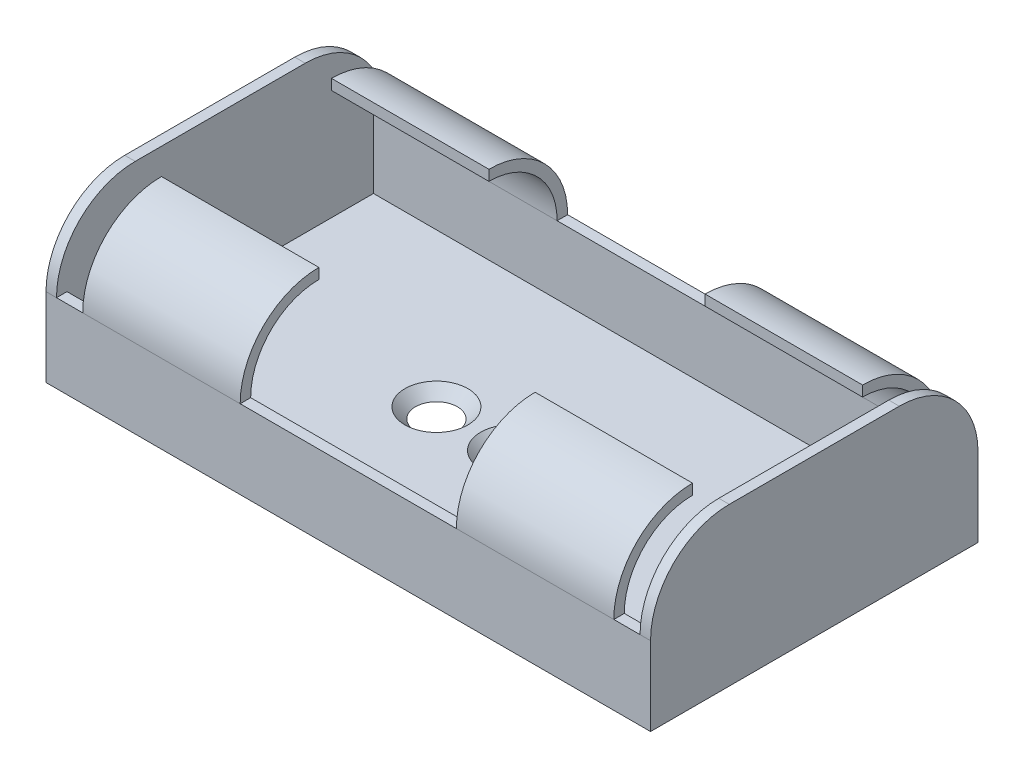
ISO-10303-21;
HEADER;
FILE_DESCRIPTION(('STEP AP214'),'2;1');
FILE_NAME('part.step','',(''),(''),'','','');
FILE_SCHEMA(('AUTOMOTIVE_DESIGN { 1 0 10303 214 1 1 1 1 }'));
ENDSEC;
DATA;
#1=APPLICATION_CONTEXT('core data for automotive mechanical design processes');
#2=APPLICATION_PROTOCOL_DEFINITION('international standard','automotive_design',2000,#1);
#3=PRODUCT_CONTEXT('',#1,'mechanical');
#4=PRODUCT('Part','Part','',(#3));
#5=PRODUCT_RELATED_PRODUCT_CATEGORY('part','',(#4));
#6=PRODUCT_DEFINITION_FORMATION('','',#4);
#7=PRODUCT_DEFINITION_CONTEXT('part definition',#1,'design');
#8=PRODUCT_DEFINITION('design','',#6,#7);
#9=PRODUCT_DEFINITION_SHAPE('','',#8);
#10=(LENGTH_UNIT() NAMED_UNIT(*) SI_UNIT(.MILLI.,.METRE.));
#11=(NAMED_UNIT(*) PLANE_ANGLE_UNIT() SI_UNIT($,.RADIAN.));
#12=(NAMED_UNIT(*) SI_UNIT($,.STERADIAN.) SOLID_ANGLE_UNIT());
#13=UNCERTAINTY_MEASURE_WITH_UNIT(LENGTH_MEASURE(1.E-05),#10,'distance_accuracy_value','');
#14=(GEOMETRIC_REPRESENTATION_CONTEXT(3) GLOBAL_UNCERTAINTY_ASSIGNED_CONTEXT((#13)) GLOBAL_UNIT_ASSIGNED_CONTEXT((#10,
#11,#12)) REPRESENTATION_CONTEXT('',''));
#15=CARTESIAN_POINT('',(0.,0.,0.));
#16=DIRECTION('',(0.,0.,1.));
#17=DIRECTION('',(1.,0.,0.));
#18=AXIS2_PLACEMENT_3D('',#15,#16,#17);
#19=CARTESIAN_POINT('',(0.,7.5,-8.1));
#20=DIRECTION('',(1.,0.,0.));
#21=DIRECTION('',(0.,0.,-1.));
#22=AXIS2_PLACEMENT_3D('',#19,#20,#21);
#23=CYLINDRICAL_SURFACE('',#22,7.5);
#24=CARTESIAN_POINT('',(-27.8,7.5,-8.1));
#25=DIRECTION('',(-1.,0.,0.));
#26=DIRECTION('',(0.,0.,1.));
#27=AXIS2_PLACEMENT_3D('',#24,#25,#26);
#28=CIRCLE('',#27,7.5);
#29=CARTESIAN_POINT('',(-27.8,7.5,-15.6));
#30=VERTEX_POINT('',#29);
#31=CARTESIAN_POINT('',(-27.8,15.,-8.1));
#32=VERTEX_POINT('',#31);
#33=EDGE_CURVE('E233',#30,#32,#28,.F.);
#34=ORIENTED_EDGE('',*,*,#33,.F.);
#35=DIRECTION('',(-1.,0.,0.));
#36=VECTOR('',#35,1.);
#37=CARTESIAN_POINT('',(28.8,7.5,-15.6));
#38=LINE('',#37,#36);
#39=CARTESIAN_POINT('',(-28.8,7.5,-15.6));
#40=VERTEX_POINT('',#39);
#41=EDGE_CURVE('E258',#40,#30,#38,.F.);
#42=ORIENTED_EDGE('',*,*,#41,.F.);
#43=CARTESIAN_POINT('',(-28.8,7.5,-8.1));
#44=DIRECTION('',(1.,0.,0.));
#45=DIRECTION('',(0.,0.,-1.));
#46=AXIS2_PLACEMENT_3D('',#43,#44,#45);
#47=CIRCLE('',#46,7.5);
#48=CARTESIAN_POINT('',(-28.8,15.,-8.1));
#49=VERTEX_POINT('',#48);
#50=EDGE_CURVE('E275',#49,#40,#47,.F.);
#51=ORIENTED_EDGE('',*,*,#50,.F.);
#52=DIRECTION('',(-1.,0.,0.));
#53=VECTOR('',#52,1.);
#54=CARTESIAN_POINT('',(-28.8,15.,-8.1));
#55=LINE('',#54,#53);
#56=EDGE_CURVE('E259',#32,#49,#55,.T.);
#57=ORIENTED_EDGE('',*,*,#56,.F.);
#58=EDGE_LOOP('',(#34,#42,#51,#57));
#59=FACE_BOUND('',#58,.T.);
#60=ADVANCED_FACE('F32',(#59),#23,.T.);
#61=CARTESIAN_POINT('',(-25.3,7.5,-8.1));
#62=DIRECTION('',(1.,0.,0.));
#63=DIRECTION('',(0.,0.,-1.));
#64=AXIS2_PLACEMENT_3D('',#61,#62,#63);
#65=CIRCLE('',#64,7.5);
#66=CARTESIAN_POINT('',(-25.3,15.,-8.1));
#67=VERTEX_POINT('',#66);
#68=CARTESIAN_POINT('',(-25.3,7.5,-15.6));
#69=VERTEX_POINT('',#68);
#70=EDGE_CURVE('E365',#67,#69,#65,.F.);
#71=ORIENTED_EDGE('',*,*,#70,.F.);
#72=DIRECTION('',(-1.,0.,0.));
#73=VECTOR('',#72,1.);
#74=CARTESIAN_POINT('',(-28.8,15.,-8.1));
#75=LINE('',#74,#73);
#76=CARTESIAN_POINT('',(-10.3,15.,-8.1));
#77=VERTEX_POINT('',#76);
#78=EDGE_CURVE('E357',#77,#67,#75,.T.);
#79=ORIENTED_EDGE('',*,*,#78,.F.);
#80=CARTESIAN_POINT('',(-10.3,7.5,-8.1));
#81=DIRECTION('',(-1.,0.,0.));
#82=DIRECTION('',(0.,0.,1.));
#83=AXIS2_PLACEMENT_3D('',#80,#81,#82);
#84=CIRCLE('',#83,7.5);
#85=CARTESIAN_POINT('',(-10.3,7.5,-15.6));
#86=VERTEX_POINT('',#85);
#87=EDGE_CURVE('E378',#86,#77,#84,.F.);
#88=ORIENTED_EDGE('',*,*,#87,.F.);
#89=EDGE_CURVE('E268',#69,#86,#38,.F.);
#90=ORIENTED_EDGE('',*,*,#89,.F.);
#91=EDGE_LOOP('',(#71,#79,#88,#90));
#92=FACE_BOUND('',#91,.T.);
#93=ADVANCED_FACE('F507',(#92),#23,.T.);
#94=CARTESIAN_POINT('',(27.8,7.5,-8.1));
#95=DIRECTION('',(1.,0.,0.));
#96=DIRECTION('',(0.,1.,0.));
#97=AXIS2_PLACEMENT_3D('',#94,#95,#96);
#98=CIRCLE('',#97,7.5);
#99=CARTESIAN_POINT('',(27.8,15.,-8.1));
#100=VERTEX_POINT('',#99);
#101=CARTESIAN_POINT('',(27.8,7.50000000000004,-15.6));
#102=VERTEX_POINT('',#101);
#103=EDGE_CURVE('E407',#100,#102,#98,.F.);
#104=ORIENTED_EDGE('',*,*,#103,.F.);
#105=CARTESIAN_POINT('',(28.8,15.,-8.1));
#106=VERTEX_POINT('',#105);
#107=EDGE_CURVE('E283',#106,#100,#55,.T.);
#108=ORIENTED_EDGE('',*,*,#107,.F.);
#109=CARTESIAN_POINT('',(28.8,7.5,-8.1));
#110=DIRECTION('',(-1.,0.,0.));
#111=DIRECTION('',(0.,0.,1.));
#112=AXIS2_PLACEMENT_3D('',#109,#110,#111);
#113=CIRCLE('',#112,7.5);
#114=CARTESIAN_POINT('',(28.8,7.5,-15.6));
#115=VERTEX_POINT('',#114);
#116=EDGE_CURVE('E271',#115,#106,#113,.F.);
#117=ORIENTED_EDGE('',*,*,#116,.F.);
#118=EDGE_CURVE('E270',#102,#115,#38,.F.);
#119=ORIENTED_EDGE('',*,*,#118,.F.);
#120=EDGE_LOOP('',(#104,#108,#117,#119));
#121=FACE_BOUND('',#120,.T.);
#122=ADVANCED_FACE('F532',(#121),#23,.T.);
#123=CARTESIAN_POINT('',(0.,7.5,8.1));
#124=DIRECTION('',(-1.,0.,0.));
#125=DIRECTION('',(0.,0.,1.));
#126=AXIS2_PLACEMENT_3D('',#123,#124,#125);
#127=CYLINDRICAL_SURFACE('',#126,7.5);
#128=CARTESIAN_POINT('',(-27.8,7.5,8.1));
#129=DIRECTION('',(-1.,0.,0.));
#130=DIRECTION('',(0.,0.,1.));
#131=AXIS2_PLACEMENT_3D('',#128,#129,#130);
#132=CIRCLE('',#131,7.5);
#133=CARTESIAN_POINT('',(-27.8,15.,8.1));
#134=VERTEX_POINT('',#133);
#135=CARTESIAN_POINT('',(-27.8,7.5,15.6));
#136=VERTEX_POINT('',#135);
#137=EDGE_CURVE('E261',#134,#136,#132,.F.);
#138=ORIENTED_EDGE('',*,*,#137,.F.);
#139=DIRECTION('',(1.,0.,0.));
#140=VECTOR('',#139,1.);
#141=CARTESIAN_POINT('',(28.8,15.,8.1));
#142=LINE('',#141,#140);
#143=CARTESIAN_POINT('',(-28.8,15.,8.1));
#144=VERTEX_POINT('',#143);
#145=EDGE_CURVE('E288',#144,#134,#142,.T.);
#146=ORIENTED_EDGE('',*,*,#145,.F.);
#147=CARTESIAN_POINT('',(-28.8,7.5,8.1));
#148=DIRECTION('',(1.,0.,0.));
#149=DIRECTION('',(0.,0.,-1.));
#150=AXIS2_PLACEMENT_3D('',#147,#148,#149);
#151=CIRCLE('',#150,7.5);
#152=CARTESIAN_POINT('',(-28.8,7.5,15.6));
#153=VERTEX_POINT('',#152);
#154=EDGE_CURVE('E280',#153,#144,#151,.F.);
#155=ORIENTED_EDGE('',*,*,#154,.F.);
#156=DIRECTION('',(1.,0.,0.));
#157=VECTOR('',#156,1.);
#158=CARTESIAN_POINT('',(-28.8,7.5,15.6));
#159=LINE('',#158,#157);
#160=EDGE_CURVE('E536',#136,#153,#159,.F.);
#161=ORIENTED_EDGE('',*,*,#160,.F.);
#162=EDGE_LOOP('',(#138,#146,#155,#161));
#163=FACE_BOUND('',#162,.T.);
#164=ADVANCED_FACE('F614',(#163),#127,.T.);
#165=CARTESIAN_POINT('',(-25.3,7.5,8.1));
#166=DIRECTION('',(1.,0.,0.));
#167=DIRECTION('',(0.,0.,-1.));
#168=AXIS2_PLACEMENT_3D('',#165,#166,#167);
#169=CIRCLE('',#168,7.5);
#170=CARTESIAN_POINT('',(-25.3,7.5,15.6));
#171=VERTEX_POINT('',#170);
#172=CARTESIAN_POINT('',(-25.3,15.,8.1));
#173=VERTEX_POINT('',#172);
#174=EDGE_CURVE('E373',#171,#173,#169,.F.);
#175=ORIENTED_EDGE('',*,*,#174,.F.);
#176=CARTESIAN_POINT('',(-10.3,7.5,15.6));
#177=VERTEX_POINT('',#176);
#178=EDGE_CURVE('E538',#177,#171,#159,.F.);
#179=ORIENTED_EDGE('',*,*,#178,.F.);
#180=CARTESIAN_POINT('',(-10.3,7.5,8.1));
#181=DIRECTION('',(-1.,0.,0.));
#182=DIRECTION('',(0.,0.,1.));
#183=AXIS2_PLACEMENT_3D('',#180,#181,#182);
#184=CIRCLE('',#183,7.5);
#185=CARTESIAN_POINT('',(-10.3,15.,8.1));
#186=VERTEX_POINT('',#185);
#187=EDGE_CURVE('E386',#186,#177,#184,.F.);
#188=ORIENTED_EDGE('',*,*,#187,.F.);
#189=DIRECTION('',(1.,0.,0.));
#190=VECTOR('',#189,1.);
#191=CARTESIAN_POINT('',(28.8,15.,8.1));
#192=LINE('',#191,#190);
#193=EDGE_CURVE('E361',#173,#186,#192,.T.);
#194=ORIENTED_EDGE('',*,*,#193,.F.);
#195=EDGE_LOOP('',(#175,#179,#188,#194));
#196=FACE_BOUND('',#195,.T.);
#197=ADVANCED_FACE('F643',(#196),#127,.T.);
#198=CARTESIAN_POINT('',(27.8,7.5,8.1));
#199=DIRECTION('',(1.,0.,0.));
#200=DIRECTION('',(0.,1.,0.));
#201=AXIS2_PLACEMENT_3D('',#198,#199,#200);
#202=CIRCLE('',#201,7.5);
#203=CARTESIAN_POINT('',(27.8,7.50000000000004,15.6));
#204=VERTEX_POINT('',#203);
#205=CARTESIAN_POINT('',(27.8,15.,8.1));
#206=VERTEX_POINT('',#205);
#207=EDGE_CURVE('E409',#204,#206,#202,.F.);
#208=ORIENTED_EDGE('',*,*,#207,.F.);
#209=CARTESIAN_POINT('',(28.8,7.5,15.6));
#210=VERTEX_POINT('',#209);
#211=EDGE_CURVE('E540',#210,#204,#159,.F.);
#212=ORIENTED_EDGE('',*,*,#211,.F.);
#213=CARTESIAN_POINT('',(28.8,7.5,8.1));
#214=DIRECTION('',(-1.,0.,0.));
#215=DIRECTION('',(0.,0.,1.));
#216=AXIS2_PLACEMENT_3D('',#213,#214,#215);
#217=CIRCLE('',#216,7.5);
#218=CARTESIAN_POINT('',(28.8,15.,8.1));
#219=VERTEX_POINT('',#218);
#220=EDGE_CURVE('E267',#219,#210,#217,.F.);
#221=ORIENTED_EDGE('',*,*,#220,.F.);
#222=EDGE_CURVE('E291',#206,#219,#142,.T.);
#223=ORIENTED_EDGE('',*,*,#222,.F.);
#224=EDGE_LOOP('',(#208,#212,#221,#223));
#225=FACE_BOUND('',#224,.T.);
#226=ADVANCED_FACE('F597',(#225),#127,.T.);
#227=CARTESIAN_POINT('',(28.8,15.,8.1));
#228=DIRECTION('',(0.,0.,1.));
#229=DIRECTION('',(1.,0.,0.));
#230=AXIS2_PLACEMENT_3D('',#227,#228,#229);
#231=PLANE('',#230);
#232=DIRECTION('',(-1.,0.,0.));
#233=VECTOR('',#232,1.);
#234=CARTESIAN_POINT('',(0.0001,14.,8.1));
#235=LINE('',#234,#233);
#236=CARTESIAN_POINT('',(-25.3,14.,8.1));
#237=VERTEX_POINT('',#236);
#238=CARTESIAN_POINT('',(-10.3,14.,8.1));
#239=VERTEX_POINT('',#238);
#240=EDGE_CURVE('E312',#237,#239,#235,.F.);
#241=ORIENTED_EDGE('',*,*,#240,.F.);
#242=DIRECTION('',(0.,1.,0.));
#243=VECTOR('',#242,1.);
#244=CARTESIAN_POINT('',(-25.3,15.,8.1));
#245=LINE('',#244,#243);
#246=EDGE_CURVE('E375',#237,#173,#245,.T.);
#247=ORIENTED_EDGE('',*,*,#246,.T.);
#248=ORIENTED_EDGE('',*,*,#193,.T.);
#249=DIRECTION('',(0.,-1.,0.));
#250=VECTOR('',#249,1.);
#251=CARTESIAN_POINT('',(-10.3,15.,8.1));
#252=LINE('',#251,#250);
#253=EDGE_CURVE('E388',#186,#239,#252,.T.);
#254=ORIENTED_EDGE('',*,*,#253,.T.);
#255=EDGE_LOOP('',(#241,#247,#248,#254));
#256=FACE_BOUND('',#255,.T.);
#257=ADVANCED_FACE('F651',(#256),#231,.F.);
#258=CARTESIAN_POINT('',(-28.8,15.,-8.1));
#259=DIRECTION('',(0.,0.,-1.));
#260=DIRECTION('',(-1.,0.,0.));
#261=AXIS2_PLACEMENT_3D('',#258,#259,#260);
#262=PLANE('',#261);
#263=ORIENTED_EDGE('',*,*,#78,.T.);
#264=DIRECTION('',(0.,-1.,0.));
#265=VECTOR('',#264,1.);
#266=CARTESIAN_POINT('',(-25.3,15.,-8.1));
#267=LINE('',#266,#265);
#268=CARTESIAN_POINT('',(-25.3,14.,-8.1));
#269=VERTEX_POINT('',#268);
#270=EDGE_CURVE('E367',#67,#269,#267,.T.);
#271=ORIENTED_EDGE('',*,*,#270,.T.);
#272=DIRECTION('',(1.,0.,0.));
#273=VECTOR('',#272,1.);
#274=CARTESIAN_POINT('',(0.,14.,-8.1));
#275=LINE('',#274,#273);
#276=CARTESIAN_POINT('',(-10.3,14.,-8.1));
#277=VERTEX_POINT('',#276);
#278=EDGE_CURVE('E328',#277,#269,#275,.F.);
#279=ORIENTED_EDGE('',*,*,#278,.F.);
#280=DIRECTION('',(0.,1.,0.));
#281=VECTOR('',#280,1.);
#282=CARTESIAN_POINT('',(-10.3,15.,-8.1));
#283=LINE('',#282,#281);
#284=EDGE_CURVE('E380',#277,#77,#283,.T.);
#285=ORIENTED_EDGE('',*,*,#284,.T.);
#286=EDGE_LOOP('',(#263,#271,#279,#285));
#287=FACE_BOUND('',#286,.T.);
#288=ADVANCED_FACE('F504',(#287),#262,.F.);
#289=CARTESIAN_POINT('',(0.,7.5,-8.1));
#290=DIRECTION('',(1.,0.,0.));
#291=DIRECTION('',(0.,0.,-1.));
#292=AXIS2_PLACEMENT_3D('',#289,#290,#291);
#293=CYLINDRICAL_SURFACE('',#292,6.5);
#294=ORIENTED_EDGE('',*,*,#278,.T.);
#295=CARTESIAN_POINT('',(-25.3,7.5,-8.1));
#296=DIRECTION('',(1.,0.,0.));
#297=DIRECTION('',(0.,0.,-1.));
#298=AXIS2_PLACEMENT_3D('',#295,#296,#297);
#299=CIRCLE('',#298,6.5);
#300=CARTESIAN_POINT('',(-25.3,7.5,-14.6));
#301=VERTEX_POINT('',#300);
#302=EDGE_CURVE('E370',#269,#301,#299,.F.);
#303=ORIENTED_EDGE('',*,*,#302,.T.);
#304=DIRECTION('',(1.,0.,0.));
#305=VECTOR('',#304,1.);
#306=CARTESIAN_POINT('',(-28.8,7.5,-14.6));
#307=LINE('',#306,#305);
#308=CARTESIAN_POINT('',(-10.3,7.5,-14.6));
#309=VERTEX_POINT('',#308);
#310=EDGE_CURVE('E348',#301,#309,#307,.T.);
#311=ORIENTED_EDGE('',*,*,#310,.T.);
#312=CARTESIAN_POINT('',(-10.3,7.5,-8.1));
#313=DIRECTION('',(-1.,0.,0.));
#314=DIRECTION('',(0.,0.,1.));
#315=AXIS2_PLACEMENT_3D('',#312,#313,#314);
#316=CIRCLE('',#315,6.5);
#317=EDGE_CURVE('E383',#309,#277,#316,.F.);
#318=ORIENTED_EDGE('',*,*,#317,.T.);
#319=EDGE_LOOP('',(#294,#303,#311,#318));
#320=FACE_BOUND('',#319,.T.);
#321=ADVANCED_FACE('F501',(#320),#293,.F.);
#322=CARTESIAN_POINT('',(0.,7.5,8.1));
#323=DIRECTION('',(-1.,0.,0.));
#324=DIRECTION('',(0.,0.,1.));
#325=AXIS2_PLACEMENT_3D('',#322,#323,#324);
#326=CYLINDRICAL_SURFACE('',#325,6.5);
#327=DIRECTION('',(-1.,0.,0.));
#328=VECTOR('',#327,1.);
#329=CARTESIAN_POINT('',(-28.8,7.5,14.6));
#330=LINE('',#329,#328);
#331=CARTESIAN_POINT('',(-10.3,7.5,14.6));
#332=VERTEX_POINT('',#331);
#333=CARTESIAN_POINT('',(-25.3,7.5,14.6));
#334=VERTEX_POINT('',#333);
#335=EDGE_CURVE('E555',#332,#334,#330,.T.);
#336=ORIENTED_EDGE('',*,*,#335,.T.);
#337=CARTESIAN_POINT('',(-25.3,7.5,8.1));
#338=DIRECTION('',(1.,0.,0.));
#339=DIRECTION('',(0.,0.,-1.));
#340=AXIS2_PLACEMENT_3D('',#337,#338,#339);
#341=CIRCLE('',#340,6.5);
#342=EDGE_CURVE('E11',#334,#237,#341,.F.);
#343=ORIENTED_EDGE('',*,*,#342,.T.);
#344=ORIENTED_EDGE('',*,*,#240,.T.);
#345=CARTESIAN_POINT('',(-10.3,7.5,8.1));
#346=DIRECTION('',(-1.,0.,0.));
#347=DIRECTION('',(0.,0.,1.));
#348=AXIS2_PLACEMENT_3D('',#345,#346,#347);
#349=CIRCLE('',#348,6.5);
#350=EDGE_CURVE('E40',#239,#332,#349,.F.);
#351=ORIENTED_EDGE('',*,*,#350,.T.);
#352=EDGE_LOOP('',(#336,#343,#344,#351));
#353=FACE_BOUND('',#352,.T.);
#354=ADVANCED_FACE('F554',(#353),#326,.F.);
#355=CARTESIAN_POINT('',(0.,15.,0.));
#356=DIRECTION('',(0.,1.,0.));
#357=DIRECTION('',(0.,0.,1.));
#358=AXIS2_PLACEMENT_3D('',#355,#356,#357);
#359=PLANE('',#358);
#360=DIRECTION('',(0.,0.,-1.));
#361=VECTOR('',#360,1.);
#362=CARTESIAN_POINT('',(27.8,15.,-15.6));
#363=LINE('',#362,#361);
#364=EDGE_CURVE('E317',#206,#100,#363,.T.);
#365=ORIENTED_EDGE('',*,*,#364,.F.);
#366=ORIENTED_EDGE('',*,*,#222,.T.);
#367=DIRECTION('',(0.,0.,-1.));
#368=VECTOR('',#367,1.);
#369=CARTESIAN_POINT('',(28.8,15.,-15.6));
#370=LINE('',#369,#368);
#371=EDGE_CURVE('E303',#219,#106,#370,.T.);
#372=ORIENTED_EDGE('',*,*,#371,.T.);
#373=ORIENTED_EDGE('',*,*,#107,.T.);
#374=EDGE_LOOP('',(#365,#366,#372,#373));
#375=FACE_BOUND('',#374,.T.);
#376=ADVANCED_FACE('F601',(#375),#359,.T.);
#377=CARTESIAN_POINT('',(28.8,15.,-15.6));
#378=DIRECTION('',(-1.,0.,0.));
#379=DIRECTION('',(0.,0.,1.));
#380=AXIS2_PLACEMENT_3D('',#377,#378,#379);
#381=PLANE('',#380);
#382=DIRECTION('',(0.,-1.,0.));
#383=VECTOR('',#382,1.);
#384=CARTESIAN_POINT('',(28.8,15.,-15.6));
#385=LINE('',#384,#383);
#386=CARTESIAN_POINT('',(28.8,0.,-15.6));
#387=VERTEX_POINT('',#386);
#388=EDGE_CURVE('E292',#115,#387,#385,.T.);
#389=ORIENTED_EDGE('',*,*,#388,.F.);
#390=ORIENTED_EDGE('',*,*,#116,.T.);
#391=ORIENTED_EDGE('',*,*,#371,.F.);
#392=ORIENTED_EDGE('',*,*,#220,.T.);
#393=DIRECTION('',(0.,-1.,0.));
#394=VECTOR('',#393,1.);
#395=CARTESIAN_POINT('',(28.8,15.,15.6));
#396=LINE('',#395,#394);
#397=CARTESIAN_POINT('',(28.8,0.,15.6));
#398=VERTEX_POINT('',#397);
#399=EDGE_CURVE('E297',#210,#398,#396,.T.);
#400=ORIENTED_EDGE('',*,*,#399,.T.);
#401=DIRECTION('',(0.,0.,-1.));
#402=VECTOR('',#401,1.);
#403=CARTESIAN_POINT('',(28.8,0.,-15.6));
#404=LINE('',#403,#402);
#405=EDGE_CURVE('E309',#398,#387,#404,.T.);
#406=ORIENTED_EDGE('',*,*,#405,.T.);
#407=EDGE_LOOP('',(#389,#390,#391,#392,#400,#406));
#408=FACE_BOUND('',#407,.T.);
#409=ADVANCED_FACE('F602',(#408),#381,.F.);
#410=CARTESIAN_POINT('',(-28.8,15.,-15.6));
#411=DIRECTION('',(0.,0.,1.));
#412=DIRECTION('',(1.,0.,0.));
#413=AXIS2_PLACEMENT_3D('',#410,#411,#412);
#414=PLANE('',#413);
#415=DIRECTION('',(0.,-1.,0.));
#416=VECTOR('',#415,1.);
#417=CARTESIAN_POINT('',(-28.8,15.,-15.6));
#418=LINE('',#417,#416);
#419=CARTESIAN_POINT('',(-28.8,0.,-15.6));
#420=VERTEX_POINT('',#419);
#421=EDGE_CURVE('E266',#40,#420,#418,.T.);
#422=ORIENTED_EDGE('',*,*,#421,.F.);
#423=ORIENTED_EDGE('',*,*,#41,.T.);
#424=DIRECTION('',(1.,0.,0.));
#425=VECTOR('',#424,1.);
#426=CARTESIAN_POINT('',(-27.8,7.5,-15.6));
#427=LINE('',#426,#425);
#428=EDGE_CURVE('E244',#30,#69,#427,.T.);
#429=ORIENTED_EDGE('',*,*,#428,.T.);
#430=ORIENTED_EDGE('',*,*,#89,.T.);
#431=DIRECTION('',(1.,0.,0.));
#432=VECTOR('',#431,1.);
#433=CARTESIAN_POINT('',(-10.3,7.5,-15.6));
#434=LINE('',#433,#432);
#435=CARTESIAN_POINT('',(10.3,7.50000000000002,-15.6));
#436=VERTEX_POINT('',#435);
#437=EDGE_CURVE('E447',#86,#436,#434,.T.);
#438=ORIENTED_EDGE('',*,*,#437,.T.);
#439=CARTESIAN_POINT('',(25.3,7.50000000000004,-15.6));
#440=VERTEX_POINT('',#439);
#441=EDGE_CURVE('E273',#436,#440,#38,.F.);
#442=ORIENTED_EDGE('',*,*,#441,.T.);
#443=DIRECTION('',(1.,0.,0.));
#444=VECTOR('',#443,1.);
#445=CARTESIAN_POINT('',(27.8,7.50000000000004,-15.6));
#446=LINE('',#445,#444);
#447=EDGE_CURVE('E436',#440,#102,#446,.T.);
#448=ORIENTED_EDGE('',*,*,#447,.T.);
#449=ORIENTED_EDGE('',*,*,#118,.T.);
#450=ORIENTED_EDGE('',*,*,#388,.T.);
#451=DIRECTION('',(-1.,0.,0.));
#452=VECTOR('',#451,1.);
#453=CARTESIAN_POINT('',(-28.8,0.,-15.6));
#454=LINE('',#453,#452);
#455=EDGE_CURVE('E307',#387,#420,#454,.T.);
#456=ORIENTED_EDGE('',*,*,#455,.T.);
#457=EDGE_LOOP('',(#422,#423,#429,#430,#438,#442,#448,#449,#450,#456));
#458=FACE_BOUND('',#457,.T.);
#459=ADVANCED_FACE('F264',(#458),#414,.F.);
#460=CARTESIAN_POINT('',(-28.8,15.,-15.6));
#461=DIRECTION('',(1.,0.,0.));
#462=DIRECTION('',(0.,0.,-1.));
#463=AXIS2_PLACEMENT_3D('',#460,#461,#462);
#464=PLANE('',#463);
#465=DIRECTION('',(0.,0.,1.));
#466=VECTOR('',#465,1.);
#467=CARTESIAN_POINT('',(-28.8,15.,-15.6));
#468=LINE('',#467,#466);
#469=EDGE_CURVE('E299',#49,#144,#468,.T.);
#470=ORIENTED_EDGE('',*,*,#469,.F.);
#471=ORIENTED_EDGE('',*,*,#50,.T.);
#472=ORIENTED_EDGE('',*,*,#421,.T.);
#473=DIRECTION('',(0.,0.,1.));
#474=VECTOR('',#473,1.);
#475=CARTESIAN_POINT('',(-28.8,0.,-15.6));
#476=LINE('',#475,#474);
#477=CARTESIAN_POINT('',(-28.8,0.,15.6));
#478=VERTEX_POINT('',#477);
#479=EDGE_CURVE('E304',#420,#478,#476,.T.);
#480=ORIENTED_EDGE('',*,*,#479,.T.);
#481=DIRECTION('',(0.,-1.,0.));
#482=VECTOR('',#481,1.);
#483=CARTESIAN_POINT('',(-28.8,15.,15.6));
#484=LINE('',#483,#482);
#485=EDGE_CURVE('E295',#153,#478,#484,.T.);
#486=ORIENTED_EDGE('',*,*,#485,.F.);
#487=ORIENTED_EDGE('',*,*,#154,.T.);
#488=EDGE_LOOP('',(#470,#471,#472,#480,#486,#487));
#489=FACE_BOUND('',#488,.T.);
#490=ADVANCED_FACE('F610',(#489),#464,.F.);
#491=CARTESIAN_POINT('',(-28.8,15.,15.6));
#492=DIRECTION('',(0.,0.,-1.));
#493=DIRECTION('',(-1.,0.,0.));
#494=AXIS2_PLACEMENT_3D('',#491,#492,#493);
#495=PLANE('',#494);
#496=ORIENTED_EDGE('',*,*,#399,.F.);
#497=ORIENTED_EDGE('',*,*,#211,.T.);
#498=DIRECTION('',(1.,0.,0.));
#499=VECTOR('',#498,1.);
#500=CARTESIAN_POINT('',(27.8,7.50000000000004,15.6));
#501=LINE('',#500,#499);
#502=CARTESIAN_POINT('',(25.3,7.50000000000004,15.6));
#503=VERTEX_POINT('',#502);
#504=EDGE_CURVE('E433',#503,#204,#501,.T.);
#505=ORIENTED_EDGE('',*,*,#504,.F.);
#506=CARTESIAN_POINT('',(10.3,7.50000000000002,15.6));
#507=VERTEX_POINT('',#506);
#508=EDGE_CURVE('E544',#503,#507,#159,.F.);
#509=ORIENTED_EDGE('',*,*,#508,.T.);
#510=DIRECTION('',(1.,0.,0.));
#511=VECTOR('',#510,1.);
#512=CARTESIAN_POINT('',(-10.3,7.5,15.6));
#513=LINE('',#512,#511);
#514=EDGE_CURVE('E432',#177,#507,#513,.T.);
#515=ORIENTED_EDGE('',*,*,#514,.F.);
#516=ORIENTED_EDGE('',*,*,#178,.T.);
#517=DIRECTION('',(1.,0.,0.));
#518=VECTOR('',#517,1.);
#519=CARTESIAN_POINT('',(-27.8,7.5,15.6));
#520=LINE('',#519,#518);
#521=EDGE_CURVE('E252',#136,#171,#520,.T.);
#522=ORIENTED_EDGE('',*,*,#521,.F.);
#523=ORIENTED_EDGE('',*,*,#160,.T.);
#524=ORIENTED_EDGE('',*,*,#485,.T.);
#525=DIRECTION('',(1.,0.,0.));
#526=VECTOR('',#525,1.);
#527=CARTESIAN_POINT('',(-28.8,0.,15.6));
#528=LINE('',#527,#526);
#529=EDGE_CURVE('E300',#478,#398,#528,.T.);
#530=ORIENTED_EDGE('',*,*,#529,.T.);
#531=EDGE_LOOP('',(#496,#497,#505,#509,#515,#516,#522,#523,#524,#530));
#532=FACE_BOUND('',#531,.T.);
#533=ADVANCED_FACE('F592',(#532),#495,.F.);
#534=DIRECTION('',(0.,0.,1.));
#535=VECTOR('',#534,1.);
#536=CARTESIAN_POINT('',(-27.8,15.,-15.6));
#537=LINE('',#536,#535);
#538=EDGE_CURVE('E320',#32,#134,#537,.T.);
#539=ORIENTED_EDGE('',*,*,#538,.F.);
#540=ORIENTED_EDGE('',*,*,#56,.T.);
#541=ORIENTED_EDGE('',*,*,#469,.T.);
#542=ORIENTED_EDGE('',*,*,#145,.T.);
#543=EDGE_LOOP('',(#539,#540,#541,#542));
#544=FACE_BOUND('',#543,.T.);
#545=ADVANCED_FACE('F617',(#544),#359,.T.);
#546=CARTESIAN_POINT('',(0.,0.,0.));
#547=DIRECTION('',(0.,1.,0.));
#548=DIRECTION('',(0.,0.,1.));
#549=AXIS2_PLACEMENT_3D('',#546,#547,#548);
#550=PLANE('',#549);
#551=CARTESIAN_POINT('',(7.2,0.,0.));
#552=DIRECTION('',(0.,1.,0.));
#553=DIRECTION('',(0.,0.,1.));
#554=AXIS2_PLACEMENT_3D('',#551,#552,#553);
#555=CIRCLE('',#554,2.);
#556=CARTESIAN_POINT('',(7.2,0.,2.));
#557=VERTEX_POINT('',#556);
#558=EDGE_CURVE('E464',#557,#557,#555,.T.);
#559=ORIENTED_EDGE('',*,*,#558,.T.);
#560=EDGE_LOOP('',(#559));
#561=FACE_BOUND('',#560,.T.);
#562=CARTESIAN_POINT('',(0.,0.,0.));
#563=DIRECTION('',(0.,1.,0.));
#564=DIRECTION('',(0.,0.,1.));
#565=AXIS2_PLACEMENT_3D('',#562,#563,#564);
#566=CIRCLE('',#565,2.);
#567=CARTESIAN_POINT('',(0.,0.,2.));
#568=VERTEX_POINT('',#567);
#569=EDGE_CURVE('E458',#568,#568,#566,.T.);
#570=ORIENTED_EDGE('',*,*,#569,.T.);
#571=EDGE_LOOP('',(#570));
#572=FACE_BOUND('',#571,.T.);
#573=CARTESIAN_POINT('',(-7.2,0.,0.));
#574=DIRECTION('',(0.,1.,0.));
#575=DIRECTION('',(0.,0.,1.));
#576=AXIS2_PLACEMENT_3D('',#573,#574,#575);
#577=CIRCLE('',#576,2.);
#578=CARTESIAN_POINT('',(-7.2,0.,2.));
#579=VERTEX_POINT('',#578);
#580=EDGE_CURVE('E437',#579,#579,#577,.T.);
#581=ORIENTED_EDGE('',*,*,#580,.T.);
#582=EDGE_LOOP('',(#581));
#583=FACE_BOUND('',#582,.T.);
#584=ORIENTED_EDGE('',*,*,#405,.F.);
#585=ORIENTED_EDGE('',*,*,#529,.F.);
#586=ORIENTED_EDGE('',*,*,#479,.F.);
#587=ORIENTED_EDGE('',*,*,#455,.F.);
#588=EDGE_LOOP('',(#584,#585,#586,#587));
#589=FACE_BOUND('',#588,.T.);
#590=ADVANCED_FACE('F609',(#561,#572,#583,#589),#550,.F.);
#591=CARTESIAN_POINT('',(10.3,7.5,-8.1));
#592=DIRECTION('',(1.,0.,0.));
#593=DIRECTION('',(0.,1.,0.));
#594=AXIS2_PLACEMENT_3D('',#591,#592,#593);
#595=CIRCLE('',#594,7.5);
#596=CARTESIAN_POINT('',(10.3,15.,-8.1));
#597=VERTEX_POINT('',#596);
#598=EDGE_CURVE('E391',#597,#436,#595,.F.);
#599=ORIENTED_EDGE('',*,*,#598,.F.);
#600=CARTESIAN_POINT('',(25.3,15.,-8.1));
#601=VERTEX_POINT('',#600);
#602=EDGE_CURVE('E360',#601,#597,#75,.T.);
#603=ORIENTED_EDGE('',*,*,#602,.F.);
#604=CARTESIAN_POINT('',(25.3,7.5,-8.1));
#605=DIRECTION('',(-1.,0.,0.));
#606=DIRECTION('',(0.,-1.,0.));
#607=AXIS2_PLACEMENT_3D('',#604,#605,#606);
#608=CIRCLE('',#607,7.5);
#609=EDGE_CURVE('E414',#440,#601,#608,.F.);
#610=ORIENTED_EDGE('',*,*,#609,.F.);
#611=ORIENTED_EDGE('',*,*,#441,.F.);
#612=EDGE_LOOP('',(#599,#603,#610,#611));
#613=FACE_BOUND('',#612,.T.);
#614=ADVANCED_FACE('F516',(#613),#23,.T.);
#615=CARTESIAN_POINT('',(10.3,7.5,8.1));
#616=DIRECTION('',(1.,0.,0.));
#617=DIRECTION('',(0.,1.,0.));
#618=AXIS2_PLACEMENT_3D('',#615,#616,#617);
#619=CIRCLE('',#618,7.5);
#620=CARTESIAN_POINT('',(10.3,15.,8.1));
#621=VERTEX_POINT('',#620);
#622=EDGE_CURVE('E399',#507,#621,#619,.F.);
#623=ORIENTED_EDGE('',*,*,#622,.F.);
#624=ORIENTED_EDGE('',*,*,#508,.F.);
#625=CARTESIAN_POINT('',(25.3,7.5,8.1));
#626=DIRECTION('',(-1.,0.,0.));
#627=DIRECTION('',(0.,-1.,0.));
#628=AXIS2_PLACEMENT_3D('',#625,#626,#627);
#629=CIRCLE('',#628,7.5);
#630=CARTESIAN_POINT('',(25.3,15.,8.1));
#631=VERTEX_POINT('',#630);
#632=EDGE_CURVE('E419',#631,#503,#629,.F.);
#633=ORIENTED_EDGE('',*,*,#632,.F.);
#634=EDGE_CURVE('E356',#621,#631,#192,.T.);
#635=ORIENTED_EDGE('',*,*,#634,.F.);
#636=EDGE_LOOP('',(#623,#624,#633,#635));
#637=FACE_BOUND('',#636,.T.);
#638=ADVANCED_FACE('F34',(#637),#127,.T.);
#639=CARTESIAN_POINT('',(10.3,14.,8.1));
#640=VERTEX_POINT('',#639);
#641=CARTESIAN_POINT('',(25.3,14.,8.1));
#642=VERTEX_POINT('',#641);
#643=EDGE_CURVE('E322',#640,#642,#235,.F.);
#644=ORIENTED_EDGE('',*,*,#643,.F.);
#645=DIRECTION('',(0.,1.,0.));
#646=VECTOR('',#645,1.);
#647=CARTESIAN_POINT('',(10.3,15.,8.1));
#648=LINE('',#647,#646);
#649=EDGE_CURVE('E401',#640,#621,#648,.T.);
#650=ORIENTED_EDGE('',*,*,#649,.T.);
#651=ORIENTED_EDGE('',*,*,#634,.T.);
#652=DIRECTION('',(0.,-1.,0.));
#653=VECTOR('',#652,1.);
#654=CARTESIAN_POINT('',(25.3,15.,8.1));
#655=LINE('',#654,#653);
#656=EDGE_CURVE('E421',#631,#642,#655,.T.);
#657=ORIENTED_EDGE('',*,*,#656,.T.);
#658=EDGE_LOOP('',(#644,#650,#651,#657));
#659=FACE_BOUND('',#658,.T.);
#660=ADVANCED_FACE('F583',(#659),#231,.F.);
#661=ORIENTED_EDGE('',*,*,#602,.T.);
#662=DIRECTION('',(0.,-1.,0.));
#663=VECTOR('',#662,1.);
#664=CARTESIAN_POINT('',(10.3,15.0000000000001,-8.1));
#665=LINE('',#664,#663);
#666=CARTESIAN_POINT('',(10.3,14.,-8.1));
#667=VERTEX_POINT('',#666);
#668=EDGE_CURVE('E393',#597,#667,#665,.T.);
#669=ORIENTED_EDGE('',*,*,#668,.T.);
#670=CARTESIAN_POINT('',(25.3,14.,-8.1));
#671=VERTEX_POINT('',#670);
#672=EDGE_CURVE('E325',#671,#667,#275,.F.);
#673=ORIENTED_EDGE('',*,*,#672,.F.);
#674=DIRECTION('',(0.,1.,0.));
#675=VECTOR('',#674,1.);
#676=CARTESIAN_POINT('',(25.3,15.,-8.1));
#677=LINE('',#676,#675);
#678=EDGE_CURVE('E55',#671,#601,#677,.T.);
#679=ORIENTED_EDGE('',*,*,#678,.T.);
#680=EDGE_LOOP('',(#661,#669,#673,#679));
#681=FACE_BOUND('',#680,.T.);
#682=ADVANCED_FACE('F523',(#681),#262,.F.);
#683=CARTESIAN_POINT('',(27.8,15.,-15.6));
#684=DIRECTION('',(-1.,0.,0.));
#685=DIRECTION('',(0.,0.,1.));
#686=AXIS2_PLACEMENT_3D('',#683,#684,#685);
#687=PLANE('',#686);
#688=ORIENTED_EDGE('',*,*,#207,.T.);
#689=ORIENTED_EDGE('',*,*,#364,.T.);
#690=ORIENTED_EDGE('',*,*,#103,.T.);
#691=DIRECTION('',(0.,0.,1.));
#692=VECTOR('',#691,1.);
#693=CARTESIAN_POINT('',(27.8,7.50000000000004,-15.6));
#694=LINE('',#693,#692);
#695=CARTESIAN_POINT('',(27.8,7.50000000000004,-14.6));
#696=VERTEX_POINT('',#695);
#697=EDGE_CURVE('E429',#102,#696,#694,.T.);
#698=ORIENTED_EDGE('',*,*,#697,.T.);
#699=DIRECTION('',(0.,-1.,0.));
#700=VECTOR('',#699,1.);
#701=CARTESIAN_POINT('',(27.8,15.,-14.6));
#702=LINE('',#701,#700);
#703=CARTESIAN_POINT('',(27.8,1.,-14.6));
#704=VERTEX_POINT('',#703);
#705=EDGE_CURVE('E351',#696,#704,#702,.T.);
#706=ORIENTED_EDGE('',*,*,#705,.T.);
#707=DIRECTION('',(0.,0.,-1.));
#708=VECTOR('',#707,1.);
#709=CARTESIAN_POINT('',(27.8,1.,-15.6));
#710=LINE('',#709,#708);
#711=CARTESIAN_POINT('',(27.8,1.,14.6));
#712=VERTEX_POINT('',#711);
#713=EDGE_CURVE('E260',#712,#704,#710,.T.);
#714=ORIENTED_EDGE('',*,*,#713,.F.);
#715=DIRECTION('',(0.,-1.,0.));
#716=VECTOR('',#715,1.);
#717=CARTESIAN_POINT('',(27.8,15.,14.6));
#718=LINE('',#717,#716);
#719=CARTESIAN_POINT('',(27.8,7.50000000000004,14.6));
#720=VERTEX_POINT('',#719);
#721=EDGE_CURVE('E327',#720,#712,#718,.T.);
#722=ORIENTED_EDGE('',*,*,#721,.F.);
#723=EDGE_CURVE('E427',#720,#204,#694,.T.);
#724=ORIENTED_EDGE('',*,*,#723,.T.);
#725=EDGE_LOOP('',(#688,#689,#690,#698,#706,#714,#722,#724));
#726=FACE_BOUND('',#725,.T.);
#727=ADVANCED_FACE('F489',(#726),#687,.T.);
#728=CARTESIAN_POINT('',(-28.8,15.,-14.6));
#729=DIRECTION('',(0.,0.,1.));
#730=DIRECTION('',(1.,0.,0.));
#731=AXIS2_PLACEMENT_3D('',#728,#729,#730);
#732=PLANE('',#731);
#733=DIRECTION('',(0.,-1.,0.));
#734=VECTOR('',#733,1.);
#735=CARTESIAN_POINT('',(-27.8,15.,-14.6));
#736=LINE('',#735,#734);
#737=CARTESIAN_POINT('',(-27.8,7.5,-14.6));
#738=VERTEX_POINT('',#737);
#739=CARTESIAN_POINT('',(-27.8,1.,-14.6));
#740=VERTEX_POINT('',#739);
#741=EDGE_CURVE('E236',#738,#740,#736,.T.);
#742=ORIENTED_EDGE('',*,*,#741,.T.);
#743=DIRECTION('',(-1.,0.,0.));
#744=VECTOR('',#743,1.);
#745=CARTESIAN_POINT('',(-28.8,1.,-14.6));
#746=LINE('',#745,#744);
#747=EDGE_CURVE('E343',#704,#740,#746,.T.);
#748=ORIENTED_EDGE('',*,*,#747,.F.);
#749=ORIENTED_EDGE('',*,*,#705,.F.);
#750=DIRECTION('',(1.,0.,0.));
#751=VECTOR('',#750,1.);
#752=CARTESIAN_POINT('',(0.,7.49999999999999,-14.6));
#753=LINE('',#752,#751);
#754=CARTESIAN_POINT('',(25.3,7.50000000000004,-14.6));
#755=VERTEX_POINT('',#754);
#756=EDGE_CURVE('E411',#696,#755,#753,.F.);
#757=ORIENTED_EDGE('',*,*,#756,.T.);
#758=CARTESIAN_POINT('',(10.3,7.50000000000002,-14.6));
#759=VERTEX_POINT('',#758);
#760=EDGE_CURVE('E349',#759,#755,#307,.T.);
#761=ORIENTED_EDGE('',*,*,#760,.F.);
#762=DIRECTION('',(1.,0.,0.));
#763=VECTOR('',#762,1.);
#764=CARTESIAN_POINT('',(0.,7.50000000000001,-14.6));
#765=LINE('',#764,#763);
#766=EDGE_CURVE('E404',#759,#309,#765,.F.);
#767=ORIENTED_EDGE('',*,*,#766,.T.);
#768=ORIENTED_EDGE('',*,*,#310,.F.);
#769=EDGE_CURVE('E346',#738,#301,#307,.T.);
#770=ORIENTED_EDGE('',*,*,#769,.F.);
#771=EDGE_LOOP('',(#742,#748,#749,#757,#761,#767,#768,#770));
#772=FACE_BOUND('',#771,.T.);
#773=ADVANCED_FACE('F494',(#772),#732,.T.);
#774=CARTESIAN_POINT('',(-27.8,15.,-15.6));
#775=DIRECTION('',(1.,0.,0.));
#776=DIRECTION('',(0.,0.,-1.));
#777=AXIS2_PLACEMENT_3D('',#774,#775,#776);
#778=PLANE('',#777);
#779=ORIENTED_EDGE('',*,*,#538,.T.);
#780=ORIENTED_EDGE('',*,*,#137,.T.);
#781=DIRECTION('',(0.,0.,1.));
#782=VECTOR('',#781,1.);
#783=CARTESIAN_POINT('',(-27.8,7.5,-15.6));
#784=LINE('',#783,#782);
#785=CARTESIAN_POINT('',(-27.8,7.5,14.6));
#786=VERTEX_POINT('',#785);
#787=EDGE_CURVE('E240',#786,#136,#784,.T.);
#788=ORIENTED_EDGE('',*,*,#787,.F.);
#789=DIRECTION('',(0.,-1.,0.));
#790=VECTOR('',#789,1.);
#791=CARTESIAN_POINT('',(-27.8,15.,14.6));
#792=LINE('',#791,#790);
#793=CARTESIAN_POINT('',(-27.8,1.,14.6));
#794=VERTEX_POINT('',#793);
#795=EDGE_CURVE('E339',#786,#794,#792,.T.);
#796=ORIENTED_EDGE('',*,*,#795,.T.);
#797=DIRECTION('',(0.,0.,1.));
#798=VECTOR('',#797,1.);
#799=CARTESIAN_POINT('',(-27.8,1.,-15.6));
#800=LINE('',#799,#798);
#801=EDGE_CURVE('E334',#740,#794,#800,.T.);
#802=ORIENTED_EDGE('',*,*,#801,.F.);
#803=ORIENTED_EDGE('',*,*,#741,.F.);
#804=EDGE_CURVE('E228',#30,#738,#784,.T.);
#805=ORIENTED_EDGE('',*,*,#804,.F.);
#806=ORIENTED_EDGE('',*,*,#33,.T.);
#807=EDGE_LOOP('',(#779,#780,#788,#796,#802,#803,#805,#806));
#808=FACE_BOUND('',#807,.T.);
#809=ADVANCED_FACE('F231',(#808),#778,.T.);
#810=CARTESIAN_POINT('',(-28.8,15.,14.6));
#811=DIRECTION('',(0.,0.,-1.));
#812=DIRECTION('',(-1.,0.,0.));
#813=AXIS2_PLACEMENT_3D('',#810,#811,#812);
#814=PLANE('',#813);
#815=ORIENTED_EDGE('',*,*,#721,.T.);
#816=DIRECTION('',(1.,0.,0.));
#817=VECTOR('',#816,1.);
#818=CARTESIAN_POINT('',(-28.8,1.,14.6));
#819=LINE('',#818,#817);
#820=EDGE_CURVE('E321',#794,#712,#819,.T.);
#821=ORIENTED_EDGE('',*,*,#820,.F.);
#822=ORIENTED_EDGE('',*,*,#795,.F.);
#823=EDGE_CURVE('E338',#334,#786,#330,.T.);
#824=ORIENTED_EDGE('',*,*,#823,.F.);
#825=ORIENTED_EDGE('',*,*,#335,.F.);
#826=CARTESIAN_POINT('',(10.3,7.5,14.6));
#827=VERTEX_POINT('',#826);
#828=EDGE_CURVE('E563',#827,#332,#330,.T.);
#829=ORIENTED_EDGE('',*,*,#828,.F.);
#830=CARTESIAN_POINT('',(25.3,7.5,14.6));
#831=VERTEX_POINT('',#830);
#832=EDGE_CURVE('E337',#831,#827,#330,.T.);
#833=ORIENTED_EDGE('',*,*,#832,.F.);
#834=EDGE_CURVE('E331',#720,#831,#330,.T.);
#835=ORIENTED_EDGE('',*,*,#834,.F.);
#836=EDGE_LOOP('',(#815,#821,#822,#824,#825,#829,#833,#835));
#837=FACE_BOUND('',#836,.T.);
#838=ADVANCED_FACE('F478',(#837),#814,.T.);
#839=CARTESIAN_POINT('',(0.,1.,0.));
#840=DIRECTION('',(0.,1.,0.));
#841=DIRECTION('',(0.,0.,1.));
#842=AXIS2_PLACEMENT_3D('',#839,#840,#841);
#843=PLANE('',#842);
#844=CARTESIAN_POINT('',(7.2,1.,0.));
#845=DIRECTION('',(0.,1.,0.));
#846=DIRECTION('',(0.,0.,1.));
#847=AXIS2_PLACEMENT_3D('',#844,#845,#846);
#848=CIRCLE('',#847,3.);
#849=CARTESIAN_POINT('',(7.2,1.,3.));
#850=VERTEX_POINT('',#849);
#851=EDGE_CURVE('E467',#850,#850,#848,.T.);
#852=ORIENTED_EDGE('',*,*,#851,.F.);
#853=EDGE_LOOP('',(#852));
#854=FACE_BOUND('',#853,.T.);
#855=CARTESIAN_POINT('',(0.,1.,0.));
#856=DIRECTION('',(0.,1.,0.));
#857=DIRECTION('',(0.,0.,1.));
#858=AXIS2_PLACEMENT_3D('',#855,#856,#857);
#859=CIRCLE('',#858,3.);
#860=CARTESIAN_POINT('',(0.,1.,3.));
#861=VERTEX_POINT('',#860);
#862=EDGE_CURVE('E461',#861,#861,#859,.T.);
#863=ORIENTED_EDGE('',*,*,#862,.F.);
#864=EDGE_LOOP('',(#863));
#865=FACE_BOUND('',#864,.T.);
#866=CARTESIAN_POINT('',(-7.2,1.,0.));
#867=DIRECTION('',(0.,1.,0.));
#868=DIRECTION('',(0.,0.,1.));
#869=AXIS2_PLACEMENT_3D('',#866,#867,#868);
#870=CIRCLE('',#869,3.);
#871=CARTESIAN_POINT('',(-7.2,1.,3.));
#872=VERTEX_POINT('',#871);
#873=EDGE_CURVE('E455',#872,#872,#870,.T.);
#874=ORIENTED_EDGE('',*,*,#873,.F.);
#875=EDGE_LOOP('',(#874));
#876=FACE_BOUND('',#875,.T.);
#877=ORIENTED_EDGE('',*,*,#713,.T.);
#878=ORIENTED_EDGE('',*,*,#747,.T.);
#879=ORIENTED_EDGE('',*,*,#801,.T.);
#880=ORIENTED_EDGE('',*,*,#820,.T.);
#881=EDGE_LOOP('',(#877,#878,#879,#880));
#882=FACE_BOUND('',#881,.T.);
#883=ADVANCED_FACE('F474',(#854,#865,#876,#882),#843,.T.);
#884=ORIENTED_EDGE('',*,*,#672,.T.);
#885=CARTESIAN_POINT('',(10.3,7.5,-8.1));
#886=DIRECTION('',(1.,0.,0.));
#887=DIRECTION('',(0.,1.,0.));
#888=AXIS2_PLACEMENT_3D('',#885,#886,#887);
#889=CIRCLE('',#888,6.5);
#890=EDGE_CURVE('E396',#667,#759,#889,.F.);
#891=ORIENTED_EDGE('',*,*,#890,.T.);
#892=ORIENTED_EDGE('',*,*,#760,.T.);
#893=CARTESIAN_POINT('',(25.3,7.5,-8.1));
#894=DIRECTION('',(-1.,0.,0.));
#895=DIRECTION('',(0.,-1.,0.));
#896=AXIS2_PLACEMENT_3D('',#893,#894,#895);
#897=CIRCLE('',#896,6.5);
#898=EDGE_CURVE('E417',#755,#671,#897,.F.);
#899=ORIENTED_EDGE('',*,*,#898,.T.);
#900=EDGE_LOOP('',(#884,#891,#892,#899));
#901=FACE_BOUND('',#900,.T.);
#902=ADVANCED_FACE('F477',(#901),#293,.F.);
#903=ORIENTED_EDGE('',*,*,#832,.T.);
#904=CARTESIAN_POINT('',(10.3,7.5,8.1));
#905=DIRECTION('',(1.,0.,0.));
#906=DIRECTION('',(0.,1.,0.));
#907=AXIS2_PLACEMENT_3D('',#904,#905,#906);
#908=CIRCLE('',#907,6.5);
#909=EDGE_CURVE('E547',#827,#640,#908,.F.);
#910=ORIENTED_EDGE('',*,*,#909,.T.);
#911=ORIENTED_EDGE('',*,*,#643,.T.);
#912=CARTESIAN_POINT('',(25.3,7.5,8.1));
#913=DIRECTION('',(-1.,0.,0.));
#914=DIRECTION('',(0.,-1.,0.));
#915=AXIS2_PLACEMENT_3D('',#912,#913,#914);
#916=CIRCLE('',#915,6.5);
#917=EDGE_CURVE('E543',#642,#831,#916,.F.);
#918=ORIENTED_EDGE('',*,*,#917,.T.);
#919=EDGE_LOOP('',(#903,#910,#911,#918));
#920=FACE_BOUND('',#919,.T.);
#921=ADVANCED_FACE('F577',(#920),#326,.F.);
#922=CARTESIAN_POINT('',(25.3,15.,-15.6));
#923=DIRECTION('',(-1.,0.,0.));
#924=DIRECTION('',(0.,-1.,0.));
#925=AXIS2_PLACEMENT_3D('',#922,#923,#924);
#926=PLANE('',#925);
#927=ORIENTED_EDGE('',*,*,#632,.T.);
#928=DIRECTION('',(0.,0.,1.));
#929=VECTOR('',#928,1.);
#930=CARTESIAN_POINT('',(25.3,7.50000000000004,-15.6));
#931=LINE('',#930,#929);
#932=EDGE_CURVE('E428',#831,#503,#931,.T.);
#933=ORIENTED_EDGE('',*,*,#932,.F.);
#934=ORIENTED_EDGE('',*,*,#917,.F.);
#935=ORIENTED_EDGE('',*,*,#656,.F.);
#936=EDGE_LOOP('',(#927,#933,#934,#935));
#937=FACE_BOUND('',#936,.T.);
#938=ADVANCED_FACE('F580',(#937),#926,.F.);
#939=CARTESIAN_POINT('',(27.8,7.50000000000004,-15.6));
#940=DIRECTION('',(0.,-1.,0.));
#941=DIRECTION('',(1.,0.,0.));
#942=AXIS2_PLACEMENT_3D('',#939,#940,#941);
#943=PLANE('',#942);
#944=ORIENTED_EDGE('',*,*,#932,.T.);
#945=ORIENTED_EDGE('',*,*,#504,.T.);
#946=ORIENTED_EDGE('',*,*,#723,.F.);
#947=ORIENTED_EDGE('',*,*,#834,.T.);
#948=EDGE_LOOP('',(#944,#945,#946,#947));
#949=FACE_BOUND('',#948,.T.);
#950=ADVANCED_FACE('F574',(#949),#943,.F.);
#951=CARTESIAN_POINT('',(-10.3,7.5,-15.6));
#952=DIRECTION('',(0.,-1.,0.));
#953=DIRECTION('',(1.,0.,0.));
#954=AXIS2_PLACEMENT_3D('',#951,#952,#953);
#955=PLANE('',#954);
#956=DIRECTION('',(0.,0.,1.));
#957=VECTOR('',#956,1.);
#958=CARTESIAN_POINT('',(-10.3,7.5,-15.6));
#959=LINE('',#958,#957);
#960=EDGE_CURVE('E441',#332,#177,#959,.T.);
#961=ORIENTED_EDGE('',*,*,#960,.T.);
#962=ORIENTED_EDGE('',*,*,#514,.T.);
#963=DIRECTION('',(0.,0.,1.));
#964=VECTOR('',#963,1.);
#965=CARTESIAN_POINT('',(10.3,7.50000000000002,-15.6));
#966=LINE('',#965,#964);
#967=EDGE_CURVE('E440',#827,#507,#966,.T.);
#968=ORIENTED_EDGE('',*,*,#967,.F.);
#969=ORIENTED_EDGE('',*,*,#828,.T.);
#970=EDGE_LOOP('',(#961,#962,#968,#969));
#971=FACE_BOUND('',#970,.T.);
#972=ADVANCED_FACE('F661',(#971),#955,.F.);
#973=CARTESIAN_POINT('',(10.3,15.,-15.6));
#974=DIRECTION('',(1.,0.,0.));
#975=DIRECTION('',(0.,1.,0.));
#976=AXIS2_PLACEMENT_3D('',#973,#974,#975);
#977=PLANE('',#976);
#978=ORIENTED_EDGE('',*,*,#622,.T.);
#979=ORIENTED_EDGE('',*,*,#649,.F.);
#980=ORIENTED_EDGE('',*,*,#909,.F.);
#981=ORIENTED_EDGE('',*,*,#967,.T.);
#982=EDGE_LOOP('',(#978,#979,#980,#981));
#983=FACE_BOUND('',#982,.T.);
#984=ADVANCED_FACE('F688',(#983),#977,.F.);
#985=CARTESIAN_POINT('',(-10.3,15.,-15.6));
#986=DIRECTION('',(-1.,0.,0.));
#987=DIRECTION('',(0.,0.,1.));
#988=AXIS2_PLACEMENT_3D('',#985,#986,#987);
#989=PLANE('',#988);
#990=ORIENTED_EDGE('',*,*,#187,.T.);
#991=ORIENTED_EDGE('',*,*,#960,.F.);
#992=ORIENTED_EDGE('',*,*,#350,.F.);
#993=ORIENTED_EDGE('',*,*,#253,.F.);
#994=EDGE_LOOP('',(#990,#991,#992,#993));
#995=FACE_BOUND('',#994,.T.);
#996=ADVANCED_FACE('F663',(#995),#989,.F.);
#997=CARTESIAN_POINT('',(-27.8,7.5,-15.6));
#998=DIRECTION('',(0.,-1.,0.));
#999=DIRECTION('',(0.,0.,-1.));
#1000=AXIS2_PLACEMENT_3D('',#997,#998,#999);
#1001=PLANE('',#1000);
#1002=ORIENTED_EDGE('',*,*,#787,.T.);
#1003=ORIENTED_EDGE('',*,*,#521,.T.);
#1004=DIRECTION('',(0.,0.,1.));
#1005=VECTOR('',#1004,1.);
#1006=CARTESIAN_POINT('',(-25.3,7.5,-15.6));
#1007=LINE('',#1006,#1005);
#1008=EDGE_CURVE('E239',#334,#171,#1007,.T.);
#1009=ORIENTED_EDGE('',*,*,#1008,.F.);
#1010=ORIENTED_EDGE('',*,*,#823,.T.);
#1011=EDGE_LOOP('',(#1002,#1003,#1009,#1010));
#1012=FACE_BOUND('',#1011,.T.);
#1013=ADVANCED_FACE('F569',(#1012),#1001,.F.);
#1014=CARTESIAN_POINT('',(-25.3,15.,-15.6));
#1015=DIRECTION('',(1.,0.,0.));
#1016=DIRECTION('',(0.,0.,-1.));
#1017=AXIS2_PLACEMENT_3D('',#1014,#1015,#1016);
#1018=PLANE('',#1017);
#1019=ORIENTED_EDGE('',*,*,#174,.T.);
#1020=ORIENTED_EDGE('',*,*,#246,.F.);
#1021=ORIENTED_EDGE('',*,*,#342,.F.);
#1022=ORIENTED_EDGE('',*,*,#1008,.T.);
#1023=EDGE_LOOP('',(#1019,#1020,#1021,#1022));
#1024=FACE_BOUND('',#1023,.T.);
#1025=ADVANCED_FACE('F665',(#1024),#1018,.F.);
#1026=ORIENTED_EDGE('',*,*,#697,.F.);
#1027=ORIENTED_EDGE('',*,*,#447,.F.);
#1028=EDGE_CURVE('E424',#440,#755,#931,.T.);
#1029=ORIENTED_EDGE('',*,*,#1028,.T.);
#1030=ORIENTED_EDGE('',*,*,#756,.F.);
#1031=EDGE_LOOP('',(#1026,#1027,#1029,#1030));
#1032=FACE_BOUND('',#1031,.T.);
#1033=ADVANCED_FACE('F529',(#1032),#943,.F.);
#1034=ORIENTED_EDGE('',*,*,#609,.T.);
#1035=ORIENTED_EDGE('',*,*,#678,.F.);
#1036=ORIENTED_EDGE('',*,*,#898,.F.);
#1037=ORIENTED_EDGE('',*,*,#1028,.F.);
#1038=EDGE_LOOP('',(#1034,#1035,#1036,#1037));
#1039=FACE_BOUND('',#1038,.T.);
#1040=ADVANCED_FACE('F519',(#1039),#926,.F.);
#1041=ORIENTED_EDGE('',*,*,#87,.T.);
#1042=ORIENTED_EDGE('',*,*,#284,.F.);
#1043=ORIENTED_EDGE('',*,*,#317,.F.);
#1044=EDGE_CURVE('E47',#86,#309,#959,.T.);
#1045=ORIENTED_EDGE('',*,*,#1044,.F.);
#1046=EDGE_LOOP('',(#1041,#1042,#1043,#1045));
#1047=FACE_BOUND('',#1046,.T.);
#1048=ADVANCED_FACE('F686',(#1047),#989,.F.);
#1049=ORIENTED_EDGE('',*,*,#598,.T.);
#1050=EDGE_CURVE('E442',#436,#759,#966,.T.);
#1051=ORIENTED_EDGE('',*,*,#1050,.T.);
#1052=ORIENTED_EDGE('',*,*,#890,.F.);
#1053=ORIENTED_EDGE('',*,*,#668,.F.);
#1054=EDGE_LOOP('',(#1049,#1051,#1052,#1053));
#1055=FACE_BOUND('',#1054,.T.);
#1056=ADVANCED_FACE('F681',(#1055),#977,.F.);
#1057=ORIENTED_EDGE('',*,*,#1050,.F.);
#1058=ORIENTED_EDGE('',*,*,#437,.F.);
#1059=ORIENTED_EDGE('',*,*,#1044,.T.);
#1060=ORIENTED_EDGE('',*,*,#766,.F.);
#1061=EDGE_LOOP('',(#1057,#1058,#1059,#1060));
#1062=FACE_BOUND('',#1061,.T.);
#1063=ADVANCED_FACE('F511',(#1062),#955,.F.);
#1064=ORIENTED_EDGE('',*,*,#70,.T.);
#1065=EDGE_CURVE('E247',#69,#301,#1007,.T.);
#1066=ORIENTED_EDGE('',*,*,#1065,.T.);
#1067=ORIENTED_EDGE('',*,*,#302,.F.);
#1068=ORIENTED_EDGE('',*,*,#270,.F.);
#1069=EDGE_LOOP('',(#1064,#1066,#1067,#1068));
#1070=FACE_BOUND('',#1069,.T.);
#1071=ADVANCED_FACE('F498',(#1070),#1018,.F.);
#1072=ORIENTED_EDGE('',*,*,#1065,.F.);
#1073=ORIENTED_EDGE('',*,*,#428,.F.);
#1074=ORIENTED_EDGE('',*,*,#804,.T.);
#1075=ORIENTED_EDGE('',*,*,#769,.T.);
#1076=EDGE_LOOP('',(#1072,#1073,#1074,#1075));
#1077=FACE_BOUND('',#1076,.T.);
#1078=ADVANCED_FACE('F245',(#1077),#1001,.F.);
#1079=CARTESIAN_POINT('',(-7.2,1.,0.));
#1080=DIRECTION('',(0.,1.,0.));
#1081=DIRECTION('',(0.,0.,1.));
#1082=AXIS2_PLACEMENT_3D('',#1079,#1080,#1081);
#1083=CONICAL_SURFACE('',#1082,3.,0.785398163397449);
#1084=ORIENTED_EDGE('',*,*,#873,.T.);
#1085=EDGE_LOOP('',(#1084));
#1086=FACE_BOUND('',#1085,.T.);
#1087=ORIENTED_EDGE('',*,*,#580,.F.);
#1088=EDGE_LOOP('',(#1087));
#1089=FACE_BOUND('',#1088,.T.);
#1090=ADVANCED_FACE('F680',(#1086,#1089),#1083,.F.);
#1091=CARTESIAN_POINT('',(0.,1.,0.));
#1092=DIRECTION('',(0.,1.,0.));
#1093=DIRECTION('',(0.,0.,1.));
#1094=AXIS2_PLACEMENT_3D('',#1091,#1092,#1093);
#1095=CONICAL_SURFACE('',#1094,3.,0.785398163397449);
#1096=ORIENTED_EDGE('',*,*,#862,.T.);
#1097=EDGE_LOOP('',(#1096));
#1098=FACE_BOUND('',#1097,.T.);
#1099=ORIENTED_EDGE('',*,*,#569,.F.);
#1100=EDGE_LOOP('',(#1099));
#1101=FACE_BOUND('',#1100,.T.);
#1102=ADVANCED_FACE('F945',(#1098,#1101),#1095,.F.);
#1103=CARTESIAN_POINT('',(7.2,1.,0.));
#1104=DIRECTION('',(0.,1.,0.));
#1105=DIRECTION('',(0.,0.,1.));
#1106=AXIS2_PLACEMENT_3D('',#1103,#1104,#1105);
#1107=CONICAL_SURFACE('',#1106,3.,0.785398163397448);
#1108=ORIENTED_EDGE('',*,*,#851,.T.);
#1109=EDGE_LOOP('',(#1108));
#1110=FACE_BOUND('',#1109,.T.);
#1111=ORIENTED_EDGE('',*,*,#558,.F.);
#1112=EDGE_LOOP('',(#1111));
#1113=FACE_BOUND('',#1112,.T.);
#1114=ADVANCED_FACE('F471',(#1110,#1113),#1107,.F.);
#1115=CLOSED_SHELL('',(#60,#93,#122,#164,#197,#226,#257,#288,#321,#354,#376,#409,#459,#490,#533,
#545,#590,#614,#638,#660,#682,#727,#773,#809,#838,#883,#902,#921,#938,#950,#972,#984,#996,#1013,
#1025,#1033,#1040,#1048,#1056,#1063,#1071,#1078,#1090,#1102,#1114));
#1116=MANIFOLD_SOLID_BREP('B2',#1115);
#1117=ADVANCED_BREP_SHAPE_REPRESENTATION('',(#18,#1116),#14);
#1118=SHAPE_DEFINITION_REPRESENTATION(#9,#1117);
ENDSEC;
END-ISO-10303-21;
